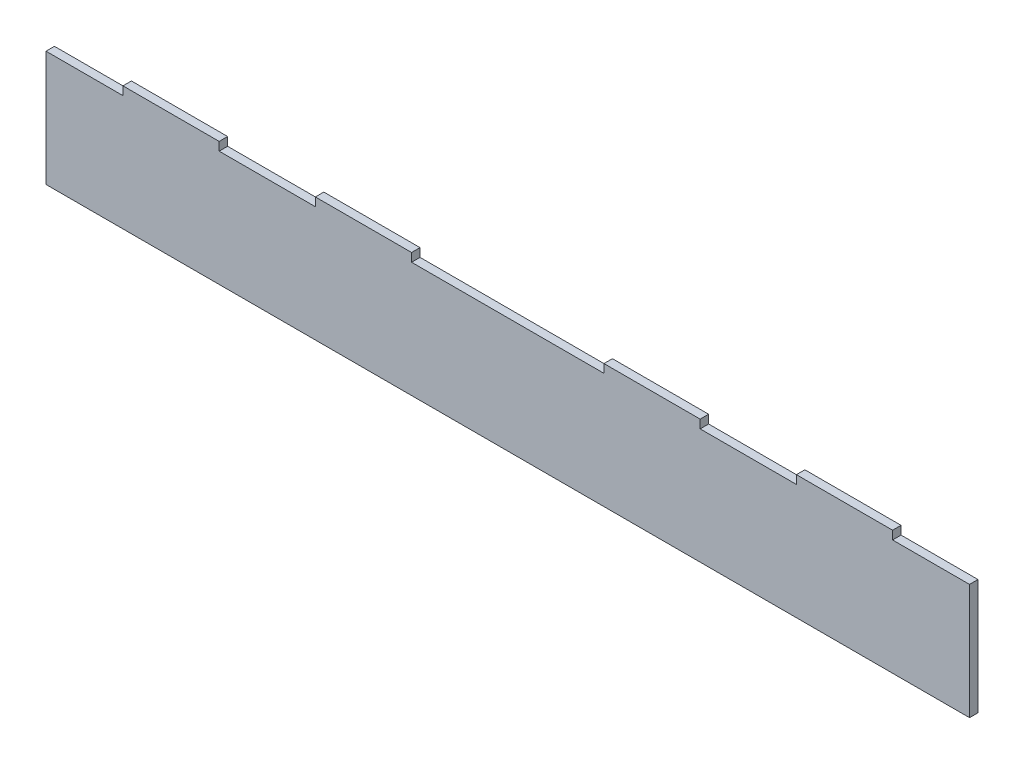
ISO-10303-21;
HEADER;
FILE_DESCRIPTION(('STEP AP214'),'2;1');
FILE_NAME('part.step','',(''),(''),'','','');
FILE_SCHEMA(('AUTOMOTIVE_DESIGN { 1 0 10303 214 1 1 1 1 }'));
ENDSEC;
DATA;
#1=APPLICATION_CONTEXT('core data for automotive mechanical design processes');
#2=APPLICATION_PROTOCOL_DEFINITION('international standard','automotive_design',2000,#1);
#3=PRODUCT_CONTEXT('',#1,'mechanical');
#4=PRODUCT('Part','Part','',(#3));
#5=PRODUCT_RELATED_PRODUCT_CATEGORY('part','',(#4));
#6=PRODUCT_DEFINITION_FORMATION('','',#4);
#7=PRODUCT_DEFINITION_CONTEXT('part definition',#1,'design');
#8=PRODUCT_DEFINITION('design','',#6,#7);
#9=PRODUCT_DEFINITION_SHAPE('','',#8);
#10=(LENGTH_UNIT() NAMED_UNIT(*) SI_UNIT(.MILLI.,.METRE.));
#11=(NAMED_UNIT(*) PLANE_ANGLE_UNIT() SI_UNIT($,.RADIAN.));
#12=(NAMED_UNIT(*) SI_UNIT($,.STERADIAN.) SOLID_ANGLE_UNIT());
#13=UNCERTAINTY_MEASURE_WITH_UNIT(LENGTH_MEASURE(1.E-05),#10,'distance_accuracy_value','');
#14=(GEOMETRIC_REPRESENTATION_CONTEXT(3) GLOBAL_UNCERTAINTY_ASSIGNED_CONTEXT((#13)) GLOBAL_UNIT_ASSIGNED_CONTEXT((#10,
#11,#12)) REPRESENTATION_CONTEXT('',''));
#15=CARTESIAN_POINT('',(0.,0.,0.));
#16=DIRECTION('',(0.,0.,1.));
#17=DIRECTION('',(1.,0.,0.));
#18=AXIS2_PLACEMENT_3D('',#15,#16,#17);
#19=CARTESIAN_POINT('',(73.6034981713434,76.0819867281815,5.588));
#20=DIRECTION('',(1.,0.,0.));
#21=DIRECTION('',(0.,1.,0.));
#22=AXIS2_PLACEMENT_3D('',#19,#20,#21);
#23=PLANE('',#22);
#24=DIRECTION('',(0.,-1.,0.));
#25=VECTOR('',#24,1.);
#26=CARTESIAN_POINT('',(73.6034981713434,76.0819867281815,0.));
#27=LINE('',#26,#25);
#28=CARTESIAN_POINT('',(73.6034981713434,76.0819867281815,0.));
#29=VERTEX_POINT('',#28);
#30=CARTESIAN_POINT('',(73.6034981713433,-0.118013271818401,0.));
#31=VERTEX_POINT('',#30);
#32=EDGE_CURVE('E203',#29,#31,#27,.T.);
#33=ORIENTED_EDGE('',*,*,#32,.T.);
#34=DIRECTION('',(0.,0.,-1.));
#35=VECTOR('',#34,1.);
#36=CARTESIAN_POINT('',(73.6034981713433,-0.118013271818401,5.588));
#37=LINE('',#36,#35);
#38=CARTESIAN_POINT('',(73.6034981713433,-0.118013271818401,5.588));
#39=VERTEX_POINT('',#38);
#40=EDGE_CURVE('E11',#39,#31,#37,.T.);
#41=ORIENTED_EDGE('',*,*,#40,.F.);
#42=DIRECTION('',(0.,-1.,0.));
#43=VECTOR('',#42,1.);
#44=CARTESIAN_POINT('',(73.6034981713434,76.0819867281815,5.588));
#45=LINE('',#44,#43);
#46=CARTESIAN_POINT('',(73.6034981713434,76.0819867281815,5.588));
#47=VERTEX_POINT('',#46);
#48=EDGE_CURVE('E241',#47,#39,#45,.T.);
#49=ORIENTED_EDGE('',*,*,#48,.F.);
#50=DIRECTION('',(0.,0.,-1.));
#51=VECTOR('',#50,1.);
#52=CARTESIAN_POINT('',(73.6034981713434,76.0819867281815,5.588));
#53=LINE('',#52,#51);
#54=EDGE_CURVE('E199',#47,#29,#53,.T.);
#55=ORIENTED_EDGE('',*,*,#54,.T.);
#56=EDGE_LOOP('',(#33,#41,#49,#55));
#57=FACE_BOUND('',#56,.T.);
#58=ADVANCED_FACE('F35',(#57),#23,.F.);
#59=CARTESIAN_POINT('',(73.6034981713433,-0.118013271818401,5.588));
#60=DIRECTION('',(0.,1.,0.));
#61=DIRECTION('',(0.,0.,1.));
#62=AXIS2_PLACEMENT_3D('',#59,#60,#61);
#63=PLANE('',#62);
#64=DIRECTION('',(1.,0.,0.));
#65=VECTOR('',#64,1.);
#66=CARTESIAN_POINT('',(73.6034981713433,-0.118013271818401,0.));
#67=LINE('',#66,#65);
#68=CARTESIAN_POINT('',(683.203498171343,-0.118013271818401,0.));
#69=VERTEX_POINT('',#68);
#70=EDGE_CURVE('E206',#31,#69,#67,.T.);
#71=ORIENTED_EDGE('',*,*,#70,.T.);
#72=DIRECTION('',(0.,0.,-1.));
#73=VECTOR('',#72,1.);
#74=CARTESIAN_POINT('',(683.203498171343,-0.118013271818401,5.588));
#75=LINE('',#74,#73);
#76=CARTESIAN_POINT('',(683.203498171343,-0.118013271818401,5.588));
#77=VERTEX_POINT('',#76);
#78=EDGE_CURVE('E43',#77,#69,#75,.T.);
#79=ORIENTED_EDGE('',*,*,#78,.F.);
#80=DIRECTION('',(1.,0.,0.));
#81=VECTOR('',#80,1.);
#82=CARTESIAN_POINT('',(73.6034981713433,-0.118013271818401,5.588));
#83=LINE('',#82,#81);
#84=EDGE_CURVE('E130',#39,#77,#83,.T.);
#85=ORIENTED_EDGE('',*,*,#84,.F.);
#86=ORIENTED_EDGE('',*,*,#40,.T.);
#87=EDGE_LOOP('',(#71,#79,#85,#86));
#88=FACE_BOUND('',#87,.T.);
#89=ADVANCED_FACE('F359',(#88),#63,.F.);
#90=CARTESIAN_POINT('',(683.203498171343,76.0819867281815,5.588));
#91=DIRECTION('',(-1.,0.,0.));
#92=DIRECTION('',(0.,-1.,0.));
#93=AXIS2_PLACEMENT_3D('',#90,#91,#92);
#94=PLANE('',#93);
#95=DIRECTION('',(0.,1.,0.));
#96=VECTOR('',#95,1.);
#97=CARTESIAN_POINT('',(683.203498171343,76.0819867281815,0.));
#98=LINE('',#97,#96);
#99=CARTESIAN_POINT('',(683.203498171343,76.0819867281815,0.));
#100=VERTEX_POINT('',#99);
#101=EDGE_CURVE('E208',#69,#100,#98,.T.);
#102=ORIENTED_EDGE('',*,*,#101,.T.);
#103=DIRECTION('',(0.,0.,-1.));
#104=VECTOR('',#103,1.);
#105=CARTESIAN_POINT('',(683.203498171343,76.0819867281815,5.588));
#106=LINE('',#105,#104);
#107=CARTESIAN_POINT('',(683.203498171343,76.0819867281815,5.588));
#108=VERTEX_POINT('',#107);
#109=EDGE_CURVE('E284',#108,#100,#106,.T.);
#110=ORIENTED_EDGE('',*,*,#109,.F.);
#111=DIRECTION('',(0.,1.,0.));
#112=VECTOR('',#111,1.);
#113=CARTESIAN_POINT('',(683.203498171343,76.0819867281815,5.588));
#114=LINE('',#113,#112);
#115=EDGE_CURVE('E292',#77,#108,#114,.T.);
#116=ORIENTED_EDGE('',*,*,#115,.F.);
#117=ORIENTED_EDGE('',*,*,#78,.T.);
#118=EDGE_LOOP('',(#102,#110,#116,#117));
#119=FACE_BOUND('',#118,.T.);
#120=ADVANCED_FACE('F290',(#119),#94,.F.);
#121=CARTESIAN_POINT('',(683.203498171343,76.0819867281815,5.588));
#122=DIRECTION('',(0.,-1.,0.));
#123=DIRECTION('',(1.,0.,0.));
#124=AXIS2_PLACEMENT_3D('',#121,#122,#123);
#125=PLANE('',#124);
#126=DIRECTION('',(-1.,0.,0.));
#127=VECTOR('',#126,1.);
#128=CARTESIAN_POINT('',(683.203498171343,76.0819867281815,0.));
#129=LINE('',#128,#127);
#130=CARTESIAN_POINT('',(632.403498171343,76.0819867281818,0.));
#131=VERTEX_POINT('',#130);
#132=EDGE_CURVE('E210',#100,#131,#129,.T.);
#133=ORIENTED_EDGE('',*,*,#132,.T.);
#134=DIRECTION('',(0.,0.,-1.));
#135=VECTOR('',#134,1.);
#136=CARTESIAN_POINT('',(632.403498171343,76.0819867281818,5.588));
#137=LINE('',#136,#135);
#138=CARTESIAN_POINT('',(632.403498171343,76.0819867281818,5.588));
#139=VERTEX_POINT('',#138);
#140=EDGE_CURVE('E281',#139,#131,#137,.T.);
#141=ORIENTED_EDGE('',*,*,#140,.F.);
#142=DIRECTION('',(-1.,0.,0.));
#143=VECTOR('',#142,1.);
#144=CARTESIAN_POINT('',(683.203498171343,76.0819867281815,5.588));
#145=LINE('',#144,#143);
#146=EDGE_CURVE('E310',#108,#139,#145,.T.);
#147=ORIENTED_EDGE('',*,*,#146,.F.);
#148=ORIENTED_EDGE('',*,*,#109,.T.);
#149=EDGE_LOOP('',(#133,#141,#147,#148));
#150=FACE_BOUND('',#149,.T.);
#151=ADVANCED_FACE('F301',(#150),#125,.F.);
#152=CARTESIAN_POINT('',(632.403498171343,76.0819867281818,5.588));
#153=DIRECTION('',(-1.,0.,0.));
#154=DIRECTION('',(0.,0.,1.));
#155=AXIS2_PLACEMENT_3D('',#152,#153,#154);
#156=PLANE('',#155);
#157=DIRECTION('',(0.,1.,0.));
#158=VECTOR('',#157,1.);
#159=CARTESIAN_POINT('',(632.403498171343,76.0819867281818,0.));
#160=LINE('',#159,#158);
#161=CARTESIAN_POINT('',(632.403498171343,81.6699867281818,0.));
#162=VERTEX_POINT('',#161);
#163=EDGE_CURVE('E212',#131,#162,#160,.T.);
#164=ORIENTED_EDGE('',*,*,#163,.T.);
#165=DIRECTION('',(0.,0.,-1.));
#166=VECTOR('',#165,1.);
#167=CARTESIAN_POINT('',(632.403498171343,81.6699867281818,5.588));
#168=LINE('',#167,#166);
#169=CARTESIAN_POINT('',(632.403498171343,81.6699867281818,5.588));
#170=VERTEX_POINT('',#169);
#171=EDGE_CURVE('E278',#170,#162,#168,.T.);
#172=ORIENTED_EDGE('',*,*,#171,.F.);
#173=DIRECTION('',(0.,1.,0.));
#174=VECTOR('',#173,1.);
#175=CARTESIAN_POINT('',(632.403498171343,76.0819867281818,5.588));
#176=LINE('',#175,#174);
#177=EDGE_CURVE('E307',#139,#170,#176,.T.);
#178=ORIENTED_EDGE('',*,*,#177,.F.);
#179=ORIENTED_EDGE('',*,*,#140,.T.);
#180=EDGE_LOOP('',(#164,#172,#178,#179));
#181=FACE_BOUND('',#180,.T.);
#182=ADVANCED_FACE('F305',(#181),#156,.F.);
#183=CARTESIAN_POINT('',(632.403498171343,81.6699867281818,5.588));
#184=DIRECTION('',(0.,-1.,0.));
#185=DIRECTION('',(1.,0.,0.));
#186=AXIS2_PLACEMENT_3D('',#183,#184,#185);
#187=PLANE('',#186);
#188=DIRECTION('',(-1.,0.,0.));
#189=VECTOR('',#188,1.);
#190=CARTESIAN_POINT('',(632.403498171343,81.6699867281818,0.));
#191=LINE('',#190,#189);
#192=CARTESIAN_POINT('',(568.903498171343,81.6699867281818,0.));
#193=VERTEX_POINT('',#192);
#194=EDGE_CURVE('E214',#162,#193,#191,.T.);
#195=ORIENTED_EDGE('',*,*,#194,.T.);
#196=DIRECTION('',(0.,0.,-1.));
#197=VECTOR('',#196,1.);
#198=CARTESIAN_POINT('',(568.903498171343,81.6699867281818,5.588));
#199=LINE('',#198,#197);
#200=CARTESIAN_POINT('',(568.903498171343,81.6699867281818,5.588));
#201=VERTEX_POINT('',#200);
#202=EDGE_CURVE('E275',#201,#193,#199,.T.);
#203=ORIENTED_EDGE('',*,*,#202,.F.);
#204=DIRECTION('',(-1.,0.,0.));
#205=VECTOR('',#204,1.);
#206=CARTESIAN_POINT('',(632.403498171343,81.6699867281818,5.588));
#207=LINE('',#206,#205);
#208=EDGE_CURVE('E309',#170,#201,#207,.T.);
#209=ORIENTED_EDGE('',*,*,#208,.F.);
#210=ORIENTED_EDGE('',*,*,#171,.T.);
#211=EDGE_LOOP('',(#195,#203,#209,#210));
#212=FACE_BOUND('',#211,.T.);
#213=ADVANCED_FACE('F372',(#212),#187,.F.);
#214=CARTESIAN_POINT('',(568.903498171343,76.0819867281818,5.588));
#215=DIRECTION('',(1.,0.,0.));
#216=DIRECTION('',(0.,0.,-1.));
#217=AXIS2_PLACEMENT_3D('',#214,#215,#216);
#218=PLANE('',#217);
#219=DIRECTION('',(0.,-1.,0.));
#220=VECTOR('',#219,1.);
#221=CARTESIAN_POINT('',(568.903498171343,76.0819867281818,0.));
#222=LINE('',#221,#220);
#223=CARTESIAN_POINT('',(568.903498171343,76.0819867281818,0.));
#224=VERTEX_POINT('',#223);
#225=EDGE_CURVE('E216',#193,#224,#222,.T.);
#226=ORIENTED_EDGE('',*,*,#225,.T.);
#227=DIRECTION('',(0.,0.,-1.));
#228=VECTOR('',#227,1.);
#229=CARTESIAN_POINT('',(568.903498171343,76.0819867281818,5.588));
#230=LINE('',#229,#228);
#231=CARTESIAN_POINT('',(568.903498171343,76.0819867281818,5.588));
#232=VERTEX_POINT('',#231);
#233=EDGE_CURVE('E272',#232,#224,#230,.T.);
#234=ORIENTED_EDGE('',*,*,#233,.F.);
#235=DIRECTION('',(0.,-1.,0.));
#236=VECTOR('',#235,1.);
#237=CARTESIAN_POINT('',(568.903498171343,76.0819867281818,5.588));
#238=LINE('',#237,#236);
#239=EDGE_CURVE('E312',#201,#232,#238,.T.);
#240=ORIENTED_EDGE('',*,*,#239,.F.);
#241=ORIENTED_EDGE('',*,*,#202,.T.);
#242=EDGE_LOOP('',(#226,#234,#240,#241));
#243=FACE_BOUND('',#242,.T.);
#244=ADVANCED_FACE('F375',(#243),#218,.F.);
#245=CARTESIAN_POINT('',(568.903498171343,76.0819867281818,5.588));
#246=DIRECTION('',(0.,-1.,0.));
#247=DIRECTION('',(1.,0.,0.));
#248=AXIS2_PLACEMENT_3D('',#245,#246,#247);
#249=PLANE('',#248);
#250=DIRECTION('',(-1.,0.,0.));
#251=VECTOR('',#250,1.);
#252=CARTESIAN_POINT('',(568.903498171343,76.0819867281818,0.));
#253=LINE('',#252,#251);
#254=CARTESIAN_POINT('',(505.403498171343,76.0819867281817,0.));
#255=VERTEX_POINT('',#254);
#256=EDGE_CURVE('E218',#224,#255,#253,.T.);
#257=ORIENTED_EDGE('',*,*,#256,.T.);
#258=DIRECTION('',(0.,0.,-1.));
#259=VECTOR('',#258,1.);
#260=CARTESIAN_POINT('',(505.403498171343,76.0819867281817,5.588));
#261=LINE('',#260,#259);
#262=CARTESIAN_POINT('',(505.403498171343,76.0819867281817,5.588));
#263=VERTEX_POINT('',#262);
#264=EDGE_CURVE('E269',#263,#255,#261,.T.);
#265=ORIENTED_EDGE('',*,*,#264,.F.);
#266=DIRECTION('',(-1.,0.,0.));
#267=VECTOR('',#266,1.);
#268=CARTESIAN_POINT('',(568.903498171343,76.0819867281818,5.588));
#269=LINE('',#268,#267);
#270=EDGE_CURVE('E318',#232,#263,#269,.T.);
#271=ORIENTED_EDGE('',*,*,#270,.F.);
#272=ORIENTED_EDGE('',*,*,#233,.T.);
#273=EDGE_LOOP('',(#257,#265,#271,#272));
#274=FACE_BOUND('',#273,.T.);
#275=ADVANCED_FACE('F379',(#274),#249,.F.);
#276=CARTESIAN_POINT('',(505.403498171343,81.6699867281817,5.588));
#277=DIRECTION('',(-1.,0.,0.));
#278=DIRECTION('',(0.,0.,1.));
#279=AXIS2_PLACEMENT_3D('',#276,#277,#278);
#280=PLANE('',#279);
#281=DIRECTION('',(0.,1.,0.));
#282=VECTOR('',#281,1.);
#283=CARTESIAN_POINT('',(505.403498171343,81.6699867281817,0.));
#284=LINE('',#283,#282);
#285=CARTESIAN_POINT('',(505.403498171343,81.6699867281817,0.));
#286=VERTEX_POINT('',#285);
#287=EDGE_CURVE('E220',#255,#286,#284,.T.);
#288=ORIENTED_EDGE('',*,*,#287,.T.);
#289=DIRECTION('',(0.,0.,-1.));
#290=VECTOR('',#289,1.);
#291=CARTESIAN_POINT('',(505.403498171343,81.6699867281817,5.588));
#292=LINE('',#291,#290);
#293=CARTESIAN_POINT('',(505.403498171343,81.6699867281817,5.588));
#294=VERTEX_POINT('',#293);
#295=EDGE_CURVE('E266',#294,#286,#292,.T.);
#296=ORIENTED_EDGE('',*,*,#295,.F.);
#297=DIRECTION('',(0.,1.,0.));
#298=VECTOR('',#297,1.);
#299=CARTESIAN_POINT('',(505.403498171343,81.6699867281817,5.588));
#300=LINE('',#299,#298);
#301=EDGE_CURVE('E320',#263,#294,#300,.T.);
#302=ORIENTED_EDGE('',*,*,#301,.F.);
#303=ORIENTED_EDGE('',*,*,#264,.T.);
#304=EDGE_LOOP('',(#288,#296,#302,#303));
#305=FACE_BOUND('',#304,.T.);
#306=ADVANCED_FACE('F383',(#305),#280,.F.);
#307=CARTESIAN_POINT('',(505.403498171343,81.6699867281817,5.588));
#308=DIRECTION('',(0.,-1.,0.));
#309=DIRECTION('',(1.,0.,0.));
#310=AXIS2_PLACEMENT_3D('',#307,#308,#309);
#311=PLANE('',#310);
#312=DIRECTION('',(-1.,0.,0.));
#313=VECTOR('',#312,1.);
#314=CARTESIAN_POINT('',(505.403498171343,81.6699867281817,0.));
#315=LINE('',#314,#313);
#316=CARTESIAN_POINT('',(441.903498171343,81.6699867281816,0.));
#317=VERTEX_POINT('',#316);
#318=EDGE_CURVE('E222',#286,#317,#315,.T.);
#319=ORIENTED_EDGE('',*,*,#318,.T.);
#320=DIRECTION('',(0.,0.,-1.));
#321=VECTOR('',#320,1.);
#322=CARTESIAN_POINT('',(441.903498171343,81.6699867281816,5.588));
#323=LINE('',#322,#321);
#324=CARTESIAN_POINT('',(441.903498171343,81.6699867281816,5.588));
#325=VERTEX_POINT('',#324);
#326=EDGE_CURVE('E263',#325,#317,#323,.T.);
#327=ORIENTED_EDGE('',*,*,#326,.F.);
#328=DIRECTION('',(-1.,0.,0.));
#329=VECTOR('',#328,1.);
#330=CARTESIAN_POINT('',(505.403498171343,81.6699867281817,5.588));
#331=LINE('',#330,#329);
#332=EDGE_CURVE('E322',#294,#325,#331,.T.);
#333=ORIENTED_EDGE('',*,*,#332,.F.);
#334=ORIENTED_EDGE('',*,*,#295,.T.);
#335=EDGE_LOOP('',(#319,#327,#333,#334));
#336=FACE_BOUND('',#335,.T.);
#337=ADVANCED_FACE('F387',(#336),#311,.F.);
#338=CARTESIAN_POINT('',(441.903498171343,81.6699867281816,5.588));
#339=DIRECTION('',(1.,0.,0.));
#340=DIRECTION('',(0.,0.,-1.));
#341=AXIS2_PLACEMENT_3D('',#338,#339,#340);
#342=PLANE('',#341);
#343=DIRECTION('',(0.,-1.,0.));
#344=VECTOR('',#343,1.);
#345=CARTESIAN_POINT('',(441.903498171343,81.6699867281816,0.));
#346=LINE('',#345,#344);
#347=CARTESIAN_POINT('',(441.903498171343,76.0819867281816,0.));
#348=VERTEX_POINT('',#347);
#349=EDGE_CURVE('E224',#317,#348,#346,.T.);
#350=ORIENTED_EDGE('',*,*,#349,.T.);
#351=DIRECTION('',(0.,0.,-1.));
#352=VECTOR('',#351,1.);
#353=CARTESIAN_POINT('',(441.903498171343,76.0819867281816,5.588));
#354=LINE('',#353,#352);
#355=CARTESIAN_POINT('',(441.903498171343,76.0819867281816,5.588));
#356=VERTEX_POINT('',#355);
#357=EDGE_CURVE('E260',#356,#348,#354,.T.);
#358=ORIENTED_EDGE('',*,*,#357,.F.);
#359=DIRECTION('',(0.,-1.,0.));
#360=VECTOR('',#359,1.);
#361=CARTESIAN_POINT('',(441.903498171343,81.6699867281816,5.588));
#362=LINE('',#361,#360);
#363=EDGE_CURVE('E324',#325,#356,#362,.T.);
#364=ORIENTED_EDGE('',*,*,#363,.F.);
#365=ORIENTED_EDGE('',*,*,#326,.T.);
#366=EDGE_LOOP('',(#350,#358,#364,#365));
#367=FACE_BOUND('',#366,.T.);
#368=ADVANCED_FACE('F391',(#367),#342,.F.);
#369=CARTESIAN_POINT('',(314.903498171343,76.0819867281815,5.588));
#370=DIRECTION('',(0.,-1.,0.));
#371=DIRECTION('',(1.,0.,0.));
#372=AXIS2_PLACEMENT_3D('',#369,#370,#371);
#373=PLANE('',#372);
#374=DIRECTION('',(-1.,0.,0.));
#375=VECTOR('',#374,1.);
#376=CARTESIAN_POINT('',(314.903498171343,76.0819867281815,0.));
#377=LINE('',#376,#375);
#378=CARTESIAN_POINT('',(314.903498171343,76.0819867281815,0.));
#379=VERTEX_POINT('',#378);
#380=EDGE_CURVE('E226',#348,#379,#377,.T.);
#381=ORIENTED_EDGE('',*,*,#380,.T.);
#382=DIRECTION('',(0.,0.,-1.));
#383=VECTOR('',#382,1.);
#384=CARTESIAN_POINT('',(314.903498171343,76.0819867281815,5.588));
#385=LINE('',#384,#383);
#386=CARTESIAN_POINT('',(314.903498171343,76.0819867281815,5.588));
#387=VERTEX_POINT('',#386);
#388=EDGE_CURVE('E257',#387,#379,#385,.T.);
#389=ORIENTED_EDGE('',*,*,#388,.F.);
#390=DIRECTION('',(-1.,0.,0.));
#391=VECTOR('',#390,1.);
#392=CARTESIAN_POINT('',(314.903498171343,76.0819867281815,5.588));
#393=LINE('',#392,#391);
#394=EDGE_CURVE('E326',#356,#387,#393,.T.);
#395=ORIENTED_EDGE('',*,*,#394,.F.);
#396=ORIENTED_EDGE('',*,*,#357,.T.);
#397=EDGE_LOOP('',(#381,#389,#395,#396));
#398=FACE_BOUND('',#397,.T.);
#399=ADVANCED_FACE('F395',(#398),#373,.F.);
#400=CARTESIAN_POINT('',(314.903498171343,81.6699867281815,5.588));
#401=DIRECTION('',(-1.,0.,0.));
#402=DIRECTION('',(0.,0.,1.));
#403=AXIS2_PLACEMENT_3D('',#400,#401,#402);
#404=PLANE('',#403);
#405=DIRECTION('',(0.,1.,0.));
#406=VECTOR('',#405,1.);
#407=CARTESIAN_POINT('',(314.903498171343,81.6699867281815,0.));
#408=LINE('',#407,#406);
#409=CARTESIAN_POINT('',(314.903498171343,81.6699867281815,0.));
#410=VERTEX_POINT('',#409);
#411=EDGE_CURVE('E228',#379,#410,#408,.T.);
#412=ORIENTED_EDGE('',*,*,#411,.T.);
#413=DIRECTION('',(0.,0.,-1.));
#414=VECTOR('',#413,1.);
#415=CARTESIAN_POINT('',(314.903498171343,81.6699867281815,5.588));
#416=LINE('',#415,#414);
#417=CARTESIAN_POINT('',(314.903498171343,81.6699867281815,5.588));
#418=VERTEX_POINT('',#417);
#419=EDGE_CURVE('E254',#418,#410,#416,.T.);
#420=ORIENTED_EDGE('',*,*,#419,.F.);
#421=DIRECTION('',(0.,1.,0.));
#422=VECTOR('',#421,1.);
#423=CARTESIAN_POINT('',(314.903498171343,81.6699867281815,5.588));
#424=LINE('',#423,#422);
#425=EDGE_CURVE('E328',#387,#418,#424,.T.);
#426=ORIENTED_EDGE('',*,*,#425,.F.);
#427=ORIENTED_EDGE('',*,*,#388,.T.);
#428=EDGE_LOOP('',(#412,#420,#426,#427));
#429=FACE_BOUND('',#428,.T.);
#430=ADVANCED_FACE('F399',(#429),#404,.F.);
#431=CARTESIAN_POINT('',(251.403498171343,81.6699867281816,5.588));
#432=DIRECTION('',(0.,-1.,0.));
#433=DIRECTION('',(1.,0.,0.));
#434=AXIS2_PLACEMENT_3D('',#431,#432,#433);
#435=PLANE('',#434);
#436=DIRECTION('',(-1.,0.,0.));
#437=VECTOR('',#436,1.);
#438=CARTESIAN_POINT('',(251.403498171343,81.6699867281816,0.));
#439=LINE('',#438,#437);
#440=CARTESIAN_POINT('',(251.403498171343,81.6699867281816,0.));
#441=VERTEX_POINT('',#440);
#442=EDGE_CURVE('E230',#410,#441,#439,.T.);
#443=ORIENTED_EDGE('',*,*,#442,.T.);
#444=DIRECTION('',(0.,0.,-1.));
#445=VECTOR('',#444,1.);
#446=CARTESIAN_POINT('',(251.403498171343,81.6699867281816,5.588));
#447=LINE('',#446,#445);
#448=CARTESIAN_POINT('',(251.403498171343,81.6699867281816,5.588));
#449=VERTEX_POINT('',#448);
#450=EDGE_CURVE('E251',#449,#441,#447,.T.);
#451=ORIENTED_EDGE('',*,*,#450,.F.);
#452=DIRECTION('',(-1.,0.,0.));
#453=VECTOR('',#452,1.);
#454=CARTESIAN_POINT('',(251.403498171343,81.6699867281816,5.588));
#455=LINE('',#454,#453);
#456=EDGE_CURVE('E330',#418,#449,#455,.T.);
#457=ORIENTED_EDGE('',*,*,#456,.F.);
#458=ORIENTED_EDGE('',*,*,#419,.T.);
#459=EDGE_LOOP('',(#443,#451,#457,#458));
#460=FACE_BOUND('',#459,.T.);
#461=ADVANCED_FACE('F403',(#460),#435,.F.);
#462=CARTESIAN_POINT('',(251.403498171343,81.6699867281816,5.588));
#463=DIRECTION('',(1.,0.,0.));
#464=DIRECTION('',(0.,0.,-1.));
#465=AXIS2_PLACEMENT_3D('',#462,#463,#464);
#466=PLANE('',#465);
#467=DIRECTION('',(0.,-1.,0.));
#468=VECTOR('',#467,1.);
#469=CARTESIAN_POINT('',(251.403498171343,81.6699867281816,0.));
#470=LINE('',#469,#468);
#471=CARTESIAN_POINT('',(251.403498171343,76.0819867281815,0.));
#472=VERTEX_POINT('',#471);
#473=EDGE_CURVE('E232',#441,#472,#470,.T.);
#474=ORIENTED_EDGE('',*,*,#473,.T.);
#475=DIRECTION('',(0.,0.,-1.));
#476=VECTOR('',#475,1.);
#477=CARTESIAN_POINT('',(251.403498171343,76.0819867281815,5.588));
#478=LINE('',#477,#476);
#479=CARTESIAN_POINT('',(251.403498171343,76.0819867281815,5.588));
#480=VERTEX_POINT('',#479);
#481=EDGE_CURVE('E248',#480,#472,#478,.T.);
#482=ORIENTED_EDGE('',*,*,#481,.F.);
#483=DIRECTION('',(0.,-1.,0.));
#484=VECTOR('',#483,1.);
#485=CARTESIAN_POINT('',(251.403498171343,81.6699867281816,5.588));
#486=LINE('',#485,#484);
#487=EDGE_CURVE('E332',#449,#480,#486,.T.);
#488=ORIENTED_EDGE('',*,*,#487,.F.);
#489=ORIENTED_EDGE('',*,*,#450,.T.);
#490=EDGE_LOOP('',(#474,#482,#488,#489));
#491=FACE_BOUND('',#490,.T.);
#492=ADVANCED_FACE('F407',(#491),#466,.F.);
#493=CARTESIAN_POINT('',(187.903498171343,76.0819867281815,5.588));
#494=DIRECTION('',(0.,-1.,0.));
#495=DIRECTION('',(1.,0.,0.));
#496=AXIS2_PLACEMENT_3D('',#493,#494,#495);
#497=PLANE('',#496);
#498=DIRECTION('',(-1.,0.,0.));
#499=VECTOR('',#498,1.);
#500=CARTESIAN_POINT('',(187.903498171343,76.0819867281815,0.));
#501=LINE('',#500,#499);
#502=CARTESIAN_POINT('',(187.903498171343,76.0819867281815,0.));
#503=VERTEX_POINT('',#502);
#504=EDGE_CURVE('E234',#472,#503,#501,.T.);
#505=ORIENTED_EDGE('',*,*,#504,.T.);
#506=DIRECTION('',(0.,0.,-1.));
#507=VECTOR('',#506,1.);
#508=CARTESIAN_POINT('',(187.903498171343,76.0819867281815,5.588));
#509=LINE('',#508,#507);
#510=CARTESIAN_POINT('',(187.903498171343,76.0819867281815,5.588));
#511=VERTEX_POINT('',#510);
#512=EDGE_CURVE('E245',#511,#503,#509,.T.);
#513=ORIENTED_EDGE('',*,*,#512,.F.);
#514=DIRECTION('',(-1.,0.,0.));
#515=VECTOR('',#514,1.);
#516=CARTESIAN_POINT('',(187.903498171343,76.0819867281815,5.588));
#517=LINE('',#516,#515);
#518=EDGE_CURVE('E334',#480,#511,#517,.T.);
#519=ORIENTED_EDGE('',*,*,#518,.F.);
#520=ORIENTED_EDGE('',*,*,#481,.T.);
#521=EDGE_LOOP('',(#505,#513,#519,#520));
#522=FACE_BOUND('',#521,.T.);
#523=ADVANCED_FACE('F340',(#522),#497,.F.);
#524=CARTESIAN_POINT('',(187.903498171343,76.0819867281815,5.588));
#525=DIRECTION('',(-1.,0.,0.));
#526=DIRECTION('',(0.,0.,1.));
#527=AXIS2_PLACEMENT_3D('',#524,#525,#526);
#528=PLANE('',#527);
#529=DIRECTION('',(0.,1.,0.));
#530=VECTOR('',#529,1.);
#531=CARTESIAN_POINT('',(187.903498171343,76.0819867281815,0.));
#532=LINE('',#531,#530);
#533=CARTESIAN_POINT('',(187.903498171343,81.6699867281815,0.));
#534=VERTEX_POINT('',#533);
#535=EDGE_CURVE('E236',#503,#534,#532,.T.);
#536=ORIENTED_EDGE('',*,*,#535,.T.);
#537=DIRECTION('',(0.,0.,-1.));
#538=VECTOR('',#537,1.);
#539=CARTESIAN_POINT('',(187.903498171343,81.6699867281815,5.588));
#540=LINE('',#539,#538);
#541=CARTESIAN_POINT('',(187.903498171343,81.6699867281815,5.588));
#542=VERTEX_POINT('',#541);
#543=EDGE_CURVE('E194',#542,#534,#540,.T.);
#544=ORIENTED_EDGE('',*,*,#543,.F.);
#545=DIRECTION('',(0.,1.,0.));
#546=VECTOR('',#545,1.);
#547=CARTESIAN_POINT('',(187.903498171343,76.0819867281815,5.588));
#548=LINE('',#547,#546);
#549=EDGE_CURVE('E185',#511,#542,#548,.T.);
#550=ORIENTED_EDGE('',*,*,#549,.F.);
#551=ORIENTED_EDGE('',*,*,#512,.T.);
#552=EDGE_LOOP('',(#536,#544,#550,#551));
#553=FACE_BOUND('',#552,.T.);
#554=ADVANCED_FACE('F344',(#553),#528,.F.);
#555=CARTESIAN_POINT('',(124.403498171343,81.6699867281815,5.588));
#556=DIRECTION('',(0.,-1.,0.));
#557=DIRECTION('',(1.,0.,0.));
#558=AXIS2_PLACEMENT_3D('',#555,#556,#557);
#559=PLANE('',#558);
#560=DIRECTION('',(-1.,0.,0.));
#561=VECTOR('',#560,1.);
#562=CARTESIAN_POINT('',(124.403498171343,81.6699867281815,0.));
#563=LINE('',#562,#561);
#564=CARTESIAN_POINT('',(124.403498171343,81.6699867281815,0.));
#565=VERTEX_POINT('',#564);
#566=EDGE_CURVE('E193',#534,#565,#563,.T.);
#567=ORIENTED_EDGE('',*,*,#566,.T.);
#568=DIRECTION('',(0.,0.,-1.));
#569=VECTOR('',#568,1.);
#570=CARTESIAN_POINT('',(124.403498171343,81.6699867281815,5.588));
#571=LINE('',#570,#569);
#572=CARTESIAN_POINT('',(124.403498171343,81.6699867281815,5.588));
#573=VERTEX_POINT('',#572);
#574=EDGE_CURVE('E190',#573,#565,#571,.T.);
#575=ORIENTED_EDGE('',*,*,#574,.F.);
#576=DIRECTION('',(-1.,0.,0.));
#577=VECTOR('',#576,1.);
#578=CARTESIAN_POINT('',(124.403498171343,81.6699867281815,5.588));
#579=LINE('',#578,#577);
#580=EDGE_CURVE('E179',#542,#573,#579,.T.);
#581=ORIENTED_EDGE('',*,*,#580,.F.);
#582=ORIENTED_EDGE('',*,*,#543,.T.);
#583=EDGE_LOOP('',(#567,#575,#581,#582));
#584=FACE_BOUND('',#583,.T.);
#585=ADVANCED_FACE('F191',(#584),#559,.F.);
#586=CARTESIAN_POINT('',(124.403498171343,76.0819867281815,5.588));
#587=DIRECTION('',(1.,0.,0.));
#588=DIRECTION('',(0.,0.,-1.));
#589=AXIS2_PLACEMENT_3D('',#586,#587,#588);
#590=PLANE('',#589);
#591=DIRECTION('',(0.,-1.,0.));
#592=VECTOR('',#591,1.);
#593=CARTESIAN_POINT('',(124.403498171343,76.0819867281815,0.));
#594=LINE('',#593,#592);
#595=CARTESIAN_POINT('',(124.403498171343,76.0819867281815,0.));
#596=VERTEX_POINT('',#595);
#597=EDGE_CURVE('E116',#565,#596,#594,.T.);
#598=ORIENTED_EDGE('',*,*,#597,.T.);
#599=DIRECTION('',(0.,0.,-1.));
#600=VECTOR('',#599,1.);
#601=CARTESIAN_POINT('',(124.403498171343,76.0819867281815,5.588));
#602=LINE('',#601,#600);
#603=CARTESIAN_POINT('',(124.403498171343,76.0819867281815,5.588));
#604=VERTEX_POINT('',#603);
#605=EDGE_CURVE('E195',#604,#596,#602,.T.);
#606=ORIENTED_EDGE('',*,*,#605,.F.);
#607=DIRECTION('',(0.,-1.,0.));
#608=VECTOR('',#607,1.);
#609=CARTESIAN_POINT('',(124.403498171343,76.0819867281815,5.588));
#610=LINE('',#609,#608);
#611=EDGE_CURVE('E183',#573,#604,#610,.T.);
#612=ORIENTED_EDGE('',*,*,#611,.F.);
#613=ORIENTED_EDGE('',*,*,#574,.T.);
#614=EDGE_LOOP('',(#598,#606,#612,#613));
#615=FACE_BOUND('',#614,.T.);
#616=ADVANCED_FACE('F197',(#615),#590,.F.);
#617=CARTESIAN_POINT('',(73.6034981713434,76.0819867281815,5.588));
#618=DIRECTION('',(0.,-1.,0.));
#619=DIRECTION('',(0.,0.,-1.));
#620=AXIS2_PLACEMENT_3D('',#617,#618,#619);
#621=PLANE('',#620);
#622=DIRECTION('',(-1.,0.,0.));
#623=VECTOR('',#622,1.);
#624=CARTESIAN_POINT('',(73.6034981713434,76.0819867281815,0.));
#625=LINE('',#624,#623);
#626=EDGE_CURVE('E122',#596,#29,#625,.T.);
#627=ORIENTED_EDGE('',*,*,#626,.T.);
#628=ORIENTED_EDGE('',*,*,#54,.F.);
#629=DIRECTION('',(-1.,0.,0.));
#630=VECTOR('',#629,1.);
#631=CARTESIAN_POINT('',(73.6034981713434,76.0819867281815,5.588));
#632=LINE('',#631,#630);
#633=EDGE_CURVE('E51',#604,#47,#632,.T.);
#634=ORIENTED_EDGE('',*,*,#633,.F.);
#635=ORIENTED_EDGE('',*,*,#605,.T.);
#636=EDGE_LOOP('',(#627,#628,#634,#635));
#637=FACE_BOUND('',#636,.T.);
#638=ADVANCED_FACE('F348',(#637),#621,.F.);
#639=CARTESIAN_POINT('',(0.,0.,5.588));
#640=DIRECTION('',(0.,0.,1.));
#641=DIRECTION('',(1.,0.,0.));
#642=AXIS2_PLACEMENT_3D('',#639,#640,#641);
#643=PLANE('',#642);
#644=ORIENTED_EDGE('',*,*,#48,.T.);
#645=ORIENTED_EDGE('',*,*,#84,.T.);
#646=ORIENTED_EDGE('',*,*,#115,.T.);
#647=ORIENTED_EDGE('',*,*,#146,.T.);
#648=ORIENTED_EDGE('',*,*,#177,.T.);
#649=ORIENTED_EDGE('',*,*,#208,.T.);
#650=ORIENTED_EDGE('',*,*,#239,.T.);
#651=ORIENTED_EDGE('',*,*,#270,.T.);
#652=ORIENTED_EDGE('',*,*,#301,.T.);
#653=ORIENTED_EDGE('',*,*,#332,.T.);
#654=ORIENTED_EDGE('',*,*,#363,.T.);
#655=ORIENTED_EDGE('',*,*,#394,.T.);
#656=ORIENTED_EDGE('',*,*,#425,.T.);
#657=ORIENTED_EDGE('',*,*,#456,.T.);
#658=ORIENTED_EDGE('',*,*,#487,.T.);
#659=ORIENTED_EDGE('',*,*,#518,.T.);
#660=ORIENTED_EDGE('',*,*,#549,.T.);
#661=ORIENTED_EDGE('',*,*,#580,.T.);
#662=ORIENTED_EDGE('',*,*,#611,.T.);
#663=ORIENTED_EDGE('',*,*,#633,.T.);
#664=EDGE_LOOP('',(#644,#645,#646,#647,#648,#649,#650,#651,#652,#653,#654,#655,#656,#657,#658,
#659,#660,#661,#662,#663));
#665=FACE_BOUND('',#664,.T.);
#666=ADVANCED_FACE('F181',(#665),#643,.T.);
#667=CARTESIAN_POINT('',(0.,0.,0.));
#668=DIRECTION('',(0.,0.,1.));
#669=DIRECTION('',(1.,0.,0.));
#670=AXIS2_PLACEMENT_3D('',#667,#668,#669);
#671=PLANE('',#670);
#672=ORIENTED_EDGE('',*,*,#32,.F.);
#673=ORIENTED_EDGE('',*,*,#626,.F.);
#674=ORIENTED_EDGE('',*,*,#597,.F.);
#675=ORIENTED_EDGE('',*,*,#566,.F.);
#676=ORIENTED_EDGE('',*,*,#535,.F.);
#677=ORIENTED_EDGE('',*,*,#504,.F.);
#678=ORIENTED_EDGE('',*,*,#473,.F.);
#679=ORIENTED_EDGE('',*,*,#442,.F.);
#680=ORIENTED_EDGE('',*,*,#411,.F.);
#681=ORIENTED_EDGE('',*,*,#380,.F.);
#682=ORIENTED_EDGE('',*,*,#349,.F.);
#683=ORIENTED_EDGE('',*,*,#318,.F.);
#684=ORIENTED_EDGE('',*,*,#287,.F.);
#685=ORIENTED_EDGE('',*,*,#256,.F.);
#686=ORIENTED_EDGE('',*,*,#225,.F.);
#687=ORIENTED_EDGE('',*,*,#194,.F.);
#688=ORIENTED_EDGE('',*,*,#163,.F.);
#689=ORIENTED_EDGE('',*,*,#132,.F.);
#690=ORIENTED_EDGE('',*,*,#101,.F.);
#691=ORIENTED_EDGE('',*,*,#70,.F.);
#692=EDGE_LOOP('',(#672,#673,#674,#675,#676,#677,#678,#679,#680,#681,#682,#683,#684,#685,#686,
#687,#688,#689,#690,#691));
#693=FACE_BOUND('',#692,.T.);
#694=ADVANCED_FACE('F296',(#693),#671,.F.);
#695=CLOSED_SHELL('',(#58,#89,#120,#151,#182,#213,#244,#275,#306,#337,#368,#399,#430,#461,#492,
#523,#554,#585,#616,#638,#666,#694));
#696=MANIFOLD_SOLID_BREP('B2',#695);
#697=ADVANCED_BREP_SHAPE_REPRESENTATION('',(#18,#696),#14);
#698=SHAPE_DEFINITION_REPRESENTATION(#9,#697);
ENDSEC;
END-ISO-10303-21;
